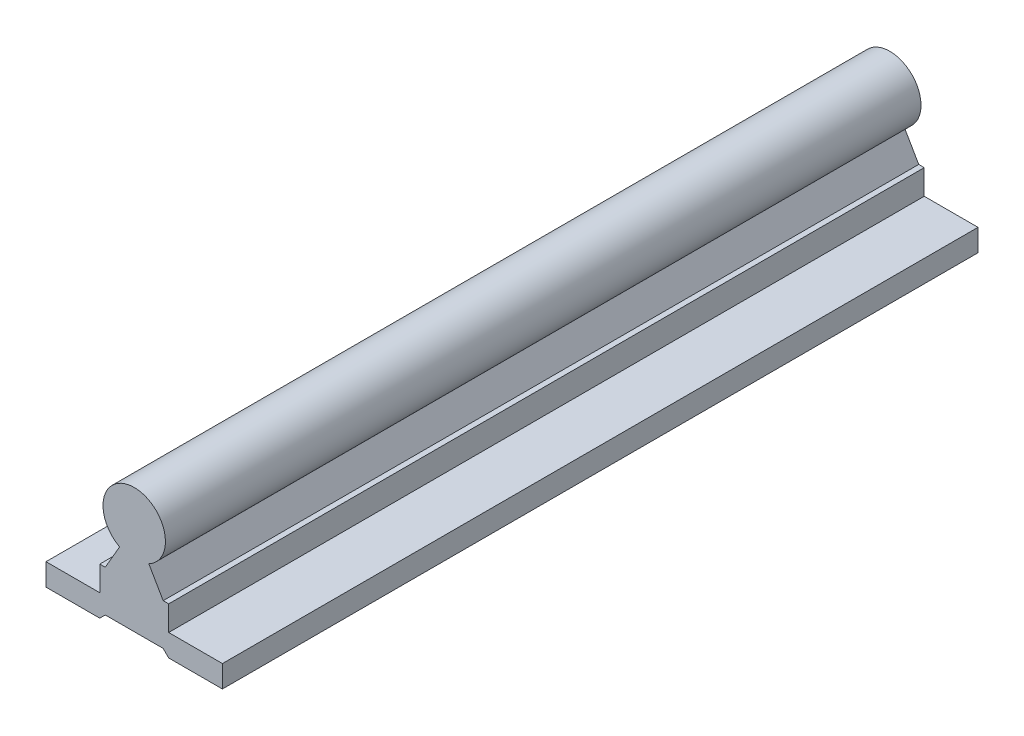
ISO-10303-21;
HEADER;
FILE_DESCRIPTION(('STEP AP214'),'2;1');
FILE_NAME('part.step','',(''),(''),'','','');
FILE_SCHEMA(('AUTOMOTIVE_DESIGN { 1 0 10303 214 1 1 1 1 }'));
ENDSEC;
DATA;
#1=APPLICATION_CONTEXT('core data for automotive mechanical design processes');
#2=APPLICATION_PROTOCOL_DEFINITION('international standard','automotive_design',2000,#1);
#3=PRODUCT_CONTEXT('',#1,'mechanical');
#4=PRODUCT('Part','Part','',(#3));
#5=PRODUCT_RELATED_PRODUCT_CATEGORY('part','',(#4));
#6=PRODUCT_DEFINITION_FORMATION('','',#4);
#7=PRODUCT_DEFINITION_CONTEXT('part definition',#1,'design');
#8=PRODUCT_DEFINITION('design','',#6,#7);
#9=PRODUCT_DEFINITION_SHAPE('','',#8);
#10=(LENGTH_UNIT() NAMED_UNIT(*) SI_UNIT(.MILLI.,.METRE.));
#11=(NAMED_UNIT(*) PLANE_ANGLE_UNIT() SI_UNIT($,.RADIAN.));
#12=(NAMED_UNIT(*) SI_UNIT($,.STERADIAN.) SOLID_ANGLE_UNIT());
#13=UNCERTAINTY_MEASURE_WITH_UNIT(LENGTH_MEASURE(1.E-05),#10,'distance_accuracy_value','');
#14=(GEOMETRIC_REPRESENTATION_CONTEXT(3) GLOBAL_UNCERTAINTY_ASSIGNED_CONTEXT((#13)) GLOBAL_UNIT_ASSIGNED_CONTEXT((#10,
#11,#12)) REPRESENTATION_CONTEXT('',''));
#15=CARTESIAN_POINT('',(0.,0.,0.));
#16=DIRECTION('',(0.,0.,1.));
#17=DIRECTION('',(1.,0.,0.));
#18=AXIS2_PLACEMENT_3D('',#15,#16,#17);
#19=CARTESIAN_POINT('',(-16.,0.,68.52));
#20=DIRECTION('',(0.,1.,0.));
#21=DIRECTION('',(0.,0.,1.));
#22=AXIS2_PLACEMENT_3D('',#19,#20,#21);
#23=PLANE('',#22);
#24=DIRECTION('',(1.,0.,0.));
#25=VECTOR('',#24,1.);
#26=CARTESIAN_POINT('',(-16.,0.,-68.52));
#27=LINE('',#26,#25);
#28=CARTESIAN_POINT('',(-16.,0.,-68.52));
#29=VERTEX_POINT('',#28);
#30=CARTESIAN_POINT('',(-6.24999999999998,0.,-68.52));
#31=VERTEX_POINT('',#30);
#32=EDGE_CURVE('E231',#29,#31,#27,.T.);
#33=ORIENTED_EDGE('',*,*,#32,.T.);
#34=DIRECTION('',(0.,0.,1.));
#35=VECTOR('',#34,1.);
#36=CARTESIAN_POINT('',(-6.24999999999997,0.,68.52));
#37=LINE('',#36,#35);
#38=CARTESIAN_POINT('',(-6.24999999999997,0.,68.52));
#39=VERTEX_POINT('',#38);
#40=EDGE_CURVE('E11',#31,#39,#37,.T.);
#41=ORIENTED_EDGE('',*,*,#40,.T.);
#42=DIRECTION('',(1.,0.,0.));
#43=VECTOR('',#42,1.);
#44=CARTESIAN_POINT('',(-16.,0.,68.52));
#45=LINE('',#44,#43);
#46=CARTESIAN_POINT('',(-16.,0.,68.52));
#47=VERTEX_POINT('',#46);
#48=EDGE_CURVE('E255',#47,#39,#45,.T.);
#49=ORIENTED_EDGE('',*,*,#48,.F.);
#50=DIRECTION('',(0.,0.,-1.));
#51=VECTOR('',#50,1.);
#52=CARTESIAN_POINT('',(-16.,0.,68.52));
#53=LINE('',#52,#51);
#54=EDGE_CURVE('E173',#47,#29,#53,.T.);
#55=ORIENTED_EDGE('',*,*,#54,.T.);
#56=EDGE_LOOP('',(#33,#41,#49,#55));
#57=FACE_BOUND('',#56,.T.);
#58=ADVANCED_FACE('F35',(#57),#23,.F.);
#59=CARTESIAN_POINT('',(-16.,0.,68.52));
#60=DIRECTION('',(1.,0.,0.));
#61=DIRECTION('',(0.,0.,-1.));
#62=AXIS2_PLACEMENT_3D('',#59,#60,#61);
#63=PLANE('',#62);
#64=DIRECTION('',(0.,-1.,0.));
#65=VECTOR('',#64,1.);
#66=CARTESIAN_POINT('',(-16.,0.,-68.52));
#67=LINE('',#66,#65);
#68=CARTESIAN_POINT('',(-16.,4.,-68.52));
#69=VERTEX_POINT('',#68);
#70=EDGE_CURVE('E159',#69,#29,#67,.T.);
#71=ORIENTED_EDGE('',*,*,#70,.T.);
#72=ORIENTED_EDGE('',*,*,#54,.F.);
#73=DIRECTION('',(0.,-1.,0.));
#74=VECTOR('',#73,1.);
#75=CARTESIAN_POINT('',(-16.,0.,68.52));
#76=LINE('',#75,#74);
#77=CARTESIAN_POINT('',(-16.,4.,68.52));
#78=VERTEX_POINT('',#77);
#79=EDGE_CURVE('E212',#78,#47,#76,.T.);
#80=ORIENTED_EDGE('',*,*,#79,.F.);
#81=DIRECTION('',(0.,0.,-1.));
#82=VECTOR('',#81,1.);
#83=CARTESIAN_POINT('',(-16.,4.,68.52));
#84=LINE('',#83,#82);
#85=EDGE_CURVE('E206',#78,#69,#84,.T.);
#86=ORIENTED_EDGE('',*,*,#85,.T.);
#87=EDGE_LOOP('',(#71,#72,#80,#86));
#88=FACE_BOUND('',#87,.T.);
#89=ADVANCED_FACE('F271',(#88),#63,.F.);
#90=CARTESIAN_POINT('',(6.24999999999997,0.,68.52));
#91=VERTEX_POINT('',#90);
#92=CARTESIAN_POINT('',(16.,0.,68.52));
#93=VERTEX_POINT('',#92);
#94=EDGE_CURVE('E258',#91,#93,#45,.T.);
#95=ORIENTED_EDGE('',*,*,#94,.F.);
#96=DIRECTION('',(0.,0.,-1.));
#97=VECTOR('',#96,1.);
#98=CARTESIAN_POINT('',(6.24999999999997,0.,68.52));
#99=LINE('',#98,#97);
#100=CARTESIAN_POINT('',(6.24999999999997,0.,-68.52));
#101=VERTEX_POINT('',#100);
#102=EDGE_CURVE('E58',#91,#101,#99,.T.);
#103=ORIENTED_EDGE('',*,*,#102,.T.);
#104=CARTESIAN_POINT('',(16.,0.,-68.52));
#105=VERTEX_POINT('',#104);
#106=EDGE_CURVE('E233',#101,#105,#27,.T.);
#107=ORIENTED_EDGE('',*,*,#106,.T.);
#108=DIRECTION('',(0.,0.,-1.));
#109=VECTOR('',#108,1.);
#110=CARTESIAN_POINT('',(16.,0.,68.52));
#111=LINE('',#110,#109);
#112=EDGE_CURVE('E176',#93,#105,#111,.T.);
#113=ORIENTED_EDGE('',*,*,#112,.F.);
#114=EDGE_LOOP('',(#95,#103,#107,#113));
#115=FACE_BOUND('',#114,.T.);
#116=ADVANCED_FACE('F322',(#115),#23,.F.);
#117=CARTESIAN_POINT('',(16.,0.,68.52));
#118=DIRECTION('',(-1.,0.,0.));
#119=DIRECTION('',(0.,0.,1.));
#120=AXIS2_PLACEMENT_3D('',#117,#118,#119);
#121=PLANE('',#120);
#122=DIRECTION('',(0.,1.,0.));
#123=VECTOR('',#122,1.);
#124=CARTESIAN_POINT('',(16.,0.,-68.52));
#125=LINE('',#124,#123);
#126=CARTESIAN_POINT('',(16.,4.,-68.52));
#127=VERTEX_POINT('',#126);
#128=EDGE_CURVE('E229',#105,#127,#125,.T.);
#129=ORIENTED_EDGE('',*,*,#128,.T.);
#130=DIRECTION('',(0.,0.,-1.));
#131=VECTOR('',#130,1.);
#132=CARTESIAN_POINT('',(16.,4.,68.52));
#133=LINE('',#132,#131);
#134=CARTESIAN_POINT('',(16.,4.,68.52));
#135=VERTEX_POINT('',#134);
#136=EDGE_CURVE('E179',#135,#127,#133,.T.);
#137=ORIENTED_EDGE('',*,*,#136,.F.);
#138=DIRECTION('',(0.,1.,0.));
#139=VECTOR('',#138,1.);
#140=CARTESIAN_POINT('',(16.,0.,68.52));
#141=LINE('',#140,#139);
#142=EDGE_CURVE('E253',#93,#135,#141,.T.);
#143=ORIENTED_EDGE('',*,*,#142,.F.);
#144=ORIENTED_EDGE('',*,*,#112,.T.);
#145=EDGE_LOOP('',(#129,#137,#143,#144));
#146=FACE_BOUND('',#145,.T.);
#147=ADVANCED_FACE('F320',(#146),#121,.F.);
#148=CARTESIAN_POINT('',(6.25,4.,68.52));
#149=DIRECTION('',(0.,-1.,0.));
#150=DIRECTION('',(0.,0.,-1.));
#151=AXIS2_PLACEMENT_3D('',#148,#149,#150);
#152=PLANE('',#151);
#153=DIRECTION('',(-1.,0.,0.));
#154=VECTOR('',#153,1.);
#155=CARTESIAN_POINT('',(6.25,4.,-68.52));
#156=LINE('',#155,#154);
#157=CARTESIAN_POINT('',(6.25,4.,-68.52));
#158=VERTEX_POINT('',#157);
#159=EDGE_CURVE('E227',#127,#158,#156,.T.);
#160=ORIENTED_EDGE('',*,*,#159,.T.);
#161=DIRECTION('',(0.,0.,-1.));
#162=VECTOR('',#161,1.);
#163=CARTESIAN_POINT('',(6.25,4.,68.52));
#164=LINE('',#163,#162);
#165=CARTESIAN_POINT('',(6.25,4.,68.52));
#166=VERTEX_POINT('',#165);
#167=EDGE_CURVE('E182',#166,#158,#164,.T.);
#168=ORIENTED_EDGE('',*,*,#167,.F.);
#169=DIRECTION('',(-1.,0.,0.));
#170=VECTOR('',#169,1.);
#171=CARTESIAN_POINT('',(6.25,4.,68.52));
#172=LINE('',#171,#170);
#173=EDGE_CURVE('E251',#135,#166,#172,.T.);
#174=ORIENTED_EDGE('',*,*,#173,.F.);
#175=ORIENTED_EDGE('',*,*,#136,.T.);
#176=EDGE_LOOP('',(#160,#168,#174,#175));
#177=FACE_BOUND('',#176,.T.);
#178=ADVANCED_FACE('F315',(#177),#152,.F.);
#179=CARTESIAN_POINT('',(6.25,4.,68.52));
#180=DIRECTION('',(-1.,0.,0.));
#181=DIRECTION('',(0.,-1.,0.));
#182=AXIS2_PLACEMENT_3D('',#179,#180,#181);
#183=PLANE('',#182);
#184=DIRECTION('',(0.,1.,0.));
#185=VECTOR('',#184,1.);
#186=CARTESIAN_POINT('',(6.25,4.,-68.52));
#187=LINE('',#186,#185);
#188=CARTESIAN_POINT('',(6.25,8.5,-68.52));
#189=VERTEX_POINT('',#188);
#190=EDGE_CURVE('E225',#158,#189,#187,.T.);
#191=ORIENTED_EDGE('',*,*,#190,.T.);
#192=DIRECTION('',(0.,0.,-1.));
#193=VECTOR('',#192,1.);
#194=CARTESIAN_POINT('',(6.25,8.5,68.52));
#195=LINE('',#194,#193);
#196=CARTESIAN_POINT('',(6.25,8.5,68.52));
#197=VERTEX_POINT('',#196);
#198=EDGE_CURVE('E185',#197,#189,#195,.T.);
#199=ORIENTED_EDGE('',*,*,#198,.F.);
#200=DIRECTION('',(0.,1.,0.));
#201=VECTOR('',#200,1.);
#202=CARTESIAN_POINT('',(6.25,4.,68.52));
#203=LINE('',#202,#201);
#204=EDGE_CURVE('E249',#166,#197,#203,.T.);
#205=ORIENTED_EDGE('',*,*,#204,.F.);
#206=ORIENTED_EDGE('',*,*,#167,.T.);
#207=EDGE_LOOP('',(#191,#199,#205,#206));
#208=FACE_BOUND('',#207,.T.);
#209=ADVANCED_FACE('F310',(#208),#183,.F.);
#210=CARTESIAN_POINT('',(6.25,8.5,68.52));
#211=DIRECTION('',(0.,-1.,0.));
#212=DIRECTION('',(0.,0.,-1.));
#213=AXIS2_PLACEMENT_3D('',#210,#211,#212);
#214=PLANE('',#213);
#215=DIRECTION('',(-1.,0.,0.));
#216=VECTOR('',#215,1.);
#217=CARTESIAN_POINT('',(6.25,8.5,-68.52));
#218=LINE('',#217,#216);
#219=CARTESIAN_POINT('',(5.25,8.5,-68.52));
#220=VERTEX_POINT('',#219);
#221=EDGE_CURVE('E223',#189,#220,#218,.T.);
#222=ORIENTED_EDGE('',*,*,#221,.T.);
#223=DIRECTION('',(0.,0.,-1.));
#224=VECTOR('',#223,1.);
#225=CARTESIAN_POINT('',(5.25,8.5,68.52));
#226=LINE('',#225,#224);
#227=CARTESIAN_POINT('',(5.25,8.5,68.52));
#228=VERTEX_POINT('',#227);
#229=EDGE_CURVE('E188',#228,#220,#226,.T.);
#230=ORIENTED_EDGE('',*,*,#229,.F.);
#231=DIRECTION('',(-1.,0.,0.));
#232=VECTOR('',#231,1.);
#233=CARTESIAN_POINT('',(6.25,8.5,68.52));
#234=LINE('',#233,#232);
#235=EDGE_CURVE('E247',#197,#228,#234,.T.);
#236=ORIENTED_EDGE('',*,*,#235,.F.);
#237=ORIENTED_EDGE('',*,*,#198,.T.);
#238=EDGE_LOOP('',(#222,#230,#236,#237));
#239=FACE_BOUND('',#238,.T.);
#240=ADVANCED_FACE('F306',(#239),#214,.F.);
#241=CARTESIAN_POINT('',(5.25,8.5,68.52));
#242=DIRECTION('',(-0.866025403784438,-0.500000000000001,0.));
#243=DIRECTION('',(0.500000000000001,-0.866025403784438,0.));
#244=AXIS2_PLACEMENT_3D('',#241,#242,#243);
#245=PLANE('',#244);
#246=DIRECTION('',(-0.500000000000001,0.866025403784438,0.));
#247=VECTOR('',#246,1.);
#248=CARTESIAN_POINT('',(5.25,8.5,-68.52));
#249=LINE('',#248,#247);
#250=CARTESIAN_POINT('',(2.65192378864667,13.,-68.52));
#251=VERTEX_POINT('',#250);
#252=EDGE_CURVE('E221',#220,#251,#249,.T.);
#253=ORIENTED_EDGE('',*,*,#252,.T.);
#254=DIRECTION('',(0.,0.,-1.));
#255=VECTOR('',#254,1.);
#256=CARTESIAN_POINT('',(2.65192378864667,13.,68.52));
#257=LINE('',#256,#255);
#258=CARTESIAN_POINT('',(2.65192378864667,13.,68.52));
#259=VERTEX_POINT('',#258);
#260=EDGE_CURVE('E191',#259,#251,#257,.T.);
#261=ORIENTED_EDGE('',*,*,#260,.F.);
#262=DIRECTION('',(-0.500000000000001,0.866025403784438,0.));
#263=VECTOR('',#262,1.);
#264=CARTESIAN_POINT('',(5.25,8.5,68.52));
#265=LINE('',#264,#263);
#266=EDGE_CURVE('E245',#228,#259,#265,.T.);
#267=ORIENTED_EDGE('',*,*,#266,.F.);
#268=ORIENTED_EDGE('',*,*,#229,.T.);
#269=EDGE_LOOP('',(#253,#261,#267,#268));
#270=FACE_BOUND('',#269,.T.);
#271=ADVANCED_FACE('F301',(#270),#245,.F.);
#272=CARTESIAN_POINT('',(0.,18.,68.52));
#273=DIRECTION('',(0.,0.,-1.));
#274=DIRECTION('',(-1.,0.,0.));
#275=AXIS2_PLACEMENT_3D('',#272,#273,#274);
#276=CYLINDRICAL_SURFACE('',#275,5.65974379109074);
#277=CARTESIAN_POINT('',(0.,18.,-68.52));
#278=DIRECTION('',(0.,0.,1.));
#279=DIRECTION('',(-1.,0.,0.));
#280=AXIS2_PLACEMENT_3D('',#277,#278,#279);
#281=CIRCLE('',#280,5.65974379109074);
#282=CARTESIAN_POINT('',(-2.6519237886467,13.,-68.52));
#283=VERTEX_POINT('',#282);
#284=EDGE_CURVE('E219',#251,#283,#281,.T.);
#285=ORIENTED_EDGE('',*,*,#284,.T.);
#286=DIRECTION('',(0.,0.,-1.));
#287=VECTOR('',#286,1.);
#288=CARTESIAN_POINT('',(-2.6519237886467,13.,68.52));
#289=LINE('',#288,#287);
#290=CARTESIAN_POINT('',(-2.6519237886467,13.,68.52));
#291=VERTEX_POINT('',#290);
#292=EDGE_CURVE('E194',#291,#283,#289,.T.);
#293=ORIENTED_EDGE('',*,*,#292,.F.);
#294=CARTESIAN_POINT('',(0.,18.,68.52));
#295=DIRECTION('',(0.,0.,1.));
#296=DIRECTION('',(-1.,0.,0.));
#297=AXIS2_PLACEMENT_3D('',#294,#295,#296);
#298=CIRCLE('',#297,5.65974379109074);
#299=EDGE_CURVE('E243',#259,#291,#298,.T.);
#300=ORIENTED_EDGE('',*,*,#299,.F.);
#301=ORIENTED_EDGE('',*,*,#260,.T.);
#302=EDGE_LOOP('',(#285,#293,#300,#301));
#303=FACE_BOUND('',#302,.T.);
#304=ADVANCED_FACE('F295',(#303),#276,.T.);
#305=CARTESIAN_POINT('',(-2.6519237886467,13.,68.52));
#306=DIRECTION('',(0.86602540378444,-0.499999999999997,0.));
#307=DIRECTION('',(0.499999999999998,0.86602540378444,0.));
#308=AXIS2_PLACEMENT_3D('',#305,#306,#307);
#309=PLANE('',#308);
#310=DIRECTION('',(-0.499999999999997,-0.86602540378444,0.));
#311=VECTOR('',#310,1.);
#312=CARTESIAN_POINT('',(-2.6519237886467,13.,-68.52));
#313=LINE('',#312,#311);
#314=CARTESIAN_POINT('',(-5.25,8.5,-68.52));
#315=VERTEX_POINT('',#314);
#316=EDGE_CURVE('E217',#283,#315,#313,.T.);
#317=ORIENTED_EDGE('',*,*,#316,.T.);
#318=DIRECTION('',(0.,0.,-1.));
#319=VECTOR('',#318,1.);
#320=CARTESIAN_POINT('',(-5.25,8.5,68.52));
#321=LINE('',#320,#319);
#322=CARTESIAN_POINT('',(-5.25,8.5,68.52));
#323=VERTEX_POINT('',#322);
#324=EDGE_CURVE('E197',#323,#315,#321,.T.);
#325=ORIENTED_EDGE('',*,*,#324,.F.);
#326=DIRECTION('',(-0.499999999999997,-0.86602540378444,0.));
#327=VECTOR('',#326,1.);
#328=CARTESIAN_POINT('',(-2.6519237886467,13.,68.52));
#329=LINE('',#328,#327);
#330=EDGE_CURVE('E241',#291,#323,#329,.T.);
#331=ORIENTED_EDGE('',*,*,#330,.F.);
#332=ORIENTED_EDGE('',*,*,#292,.T.);
#333=EDGE_LOOP('',(#317,#325,#331,#332));
#334=FACE_BOUND('',#333,.T.);
#335=ADVANCED_FACE('F291',(#334),#309,.F.);
#336=CARTESIAN_POINT('',(-6.25,8.5,68.52));
#337=DIRECTION('',(0.,-1.,0.));
#338=DIRECTION('',(0.,0.,-1.));
#339=AXIS2_PLACEMENT_3D('',#336,#337,#338);
#340=PLANE('',#339);
#341=DIRECTION('',(-1.,0.,0.));
#342=VECTOR('',#341,1.);
#343=CARTESIAN_POINT('',(-6.25,8.5,-68.52));
#344=LINE('',#343,#342);
#345=CARTESIAN_POINT('',(-6.25,8.5,-68.52));
#346=VERTEX_POINT('',#345);
#347=EDGE_CURVE('E215',#315,#346,#344,.T.);
#348=ORIENTED_EDGE('',*,*,#347,.T.);
#349=DIRECTION('',(0.,0.,-1.));
#350=VECTOR('',#349,1.);
#351=CARTESIAN_POINT('',(-6.25,8.5,68.52));
#352=LINE('',#351,#350);
#353=CARTESIAN_POINT('',(-6.25,8.5,68.52));
#354=VERTEX_POINT('',#353);
#355=EDGE_CURVE('E200',#354,#346,#352,.T.);
#356=ORIENTED_EDGE('',*,*,#355,.F.);
#357=DIRECTION('',(-1.,0.,0.));
#358=VECTOR('',#357,1.);
#359=CARTESIAN_POINT('',(-6.25,8.5,68.52));
#360=LINE('',#359,#358);
#361=EDGE_CURVE('E239',#323,#354,#360,.T.);
#362=ORIENTED_EDGE('',*,*,#361,.F.);
#363=ORIENTED_EDGE('',*,*,#324,.T.);
#364=EDGE_LOOP('',(#348,#356,#362,#363));
#365=FACE_BOUND('',#364,.T.);
#366=ADVANCED_FACE('F286',(#365),#340,.F.);
#367=CARTESIAN_POINT('',(-6.25,4.,68.52));
#368=DIRECTION('',(1.,0.,0.));
#369=DIRECTION('',(0.,0.,-1.));
#370=AXIS2_PLACEMENT_3D('',#367,#368,#369);
#371=PLANE('',#370);
#372=DIRECTION('',(0.,-1.,0.));
#373=VECTOR('',#372,1.);
#374=CARTESIAN_POINT('',(-6.25,4.,-68.52));
#375=LINE('',#374,#373);
#376=CARTESIAN_POINT('',(-6.25,4.,-68.52));
#377=VERTEX_POINT('',#376);
#378=EDGE_CURVE('E213',#346,#377,#375,.T.);
#379=ORIENTED_EDGE('',*,*,#378,.T.);
#380=DIRECTION('',(0.,0.,-1.));
#381=VECTOR('',#380,1.);
#382=CARTESIAN_POINT('',(-6.25,4.,68.52));
#383=LINE('',#382,#381);
#384=CARTESIAN_POINT('',(-6.25,4.,68.52));
#385=VERTEX_POINT('',#384);
#386=EDGE_CURVE('E203',#385,#377,#383,.T.);
#387=ORIENTED_EDGE('',*,*,#386,.F.);
#388=DIRECTION('',(0.,-1.,0.));
#389=VECTOR('',#388,1.);
#390=CARTESIAN_POINT('',(-6.25,4.,68.52));
#391=LINE('',#390,#389);
#392=EDGE_CURVE('E237',#354,#385,#391,.T.);
#393=ORIENTED_EDGE('',*,*,#392,.F.);
#394=ORIENTED_EDGE('',*,*,#355,.T.);
#395=EDGE_LOOP('',(#379,#387,#393,#394));
#396=FACE_BOUND('',#395,.T.);
#397=ADVANCED_FACE('F280',(#396),#371,.F.);
#398=CARTESIAN_POINT('',(-16.,4.,68.52));
#399=DIRECTION('',(0.,-1.,0.));
#400=DIRECTION('',(0.,0.,-1.));
#401=AXIS2_PLACEMENT_3D('',#398,#399,#400);
#402=PLANE('',#401);
#403=DIRECTION('',(-1.,0.,0.));
#404=VECTOR('',#403,1.);
#405=CARTESIAN_POINT('',(-16.,4.,-68.52));
#406=LINE('',#405,#404);
#407=EDGE_CURVE('E210',#377,#69,#406,.T.);
#408=ORIENTED_EDGE('',*,*,#407,.T.);
#409=ORIENTED_EDGE('',*,*,#85,.F.);
#410=DIRECTION('',(-1.,0.,0.));
#411=VECTOR('',#410,1.);
#412=CARTESIAN_POINT('',(-16.,4.,68.52));
#413=LINE('',#412,#411);
#414=EDGE_CURVE('E209',#385,#78,#413,.T.);
#415=ORIENTED_EDGE('',*,*,#414,.F.);
#416=ORIENTED_EDGE('',*,*,#386,.T.);
#417=EDGE_LOOP('',(#408,#409,#415,#416));
#418=FACE_BOUND('',#417,.T.);
#419=ADVANCED_FACE('F276',(#418),#402,.F.);
#420=CARTESIAN_POINT('',(0.,18.,68.52));
#421=DIRECTION('',(0.,0.,-1.));
#422=DIRECTION('',(-1.,0.,0.));
#423=AXIS2_PLACEMENT_3D('',#420,#421,#422);
#424=PLANE('',#423);
#425=DIRECTION('',(-1.,0.,0.));
#426=VECTOR('',#425,1.);
#427=CARTESIAN_POINT('',(-5.25,1.,68.52));
#428=LINE('',#427,#426);
#429=CARTESIAN_POINT('',(5.25,1.,68.52));
#430=VERTEX_POINT('',#429);
#431=CARTESIAN_POINT('',(-5.25,1.,68.52));
#432=VERTEX_POINT('',#431);
#433=EDGE_CURVE('E157',#430,#432,#428,.T.);
#434=ORIENTED_EDGE('',*,*,#433,.F.);
#435=DIRECTION('',(-0.707106781186547,0.707106781186548,0.));
#436=VECTOR('',#435,1.);
#437=CARTESIAN_POINT('',(5.25,0.999999999999973,68.52));
#438=LINE('',#437,#436);
#439=EDGE_CURVE('E167',#430,#91,#438,.F.);
#440=ORIENTED_EDGE('',*,*,#439,.T.);
#441=ORIENTED_EDGE('',*,*,#94,.T.);
#442=ORIENTED_EDGE('',*,*,#142,.T.);
#443=ORIENTED_EDGE('',*,*,#173,.T.);
#444=ORIENTED_EDGE('',*,*,#204,.T.);
#445=ORIENTED_EDGE('',*,*,#235,.T.);
#446=ORIENTED_EDGE('',*,*,#266,.T.);
#447=ORIENTED_EDGE('',*,*,#299,.T.);
#448=ORIENTED_EDGE('',*,*,#330,.T.);
#449=ORIENTED_EDGE('',*,*,#361,.T.);
#450=ORIENTED_EDGE('',*,*,#392,.T.);
#451=ORIENTED_EDGE('',*,*,#414,.T.);
#452=ORIENTED_EDGE('',*,*,#79,.T.);
#453=ORIENTED_EDGE('',*,*,#48,.T.);
#454=DIRECTION('',(-0.707106781186548,-0.707106781186547,0.));
#455=VECTOR('',#454,1.);
#456=CARTESIAN_POINT('',(-6.24999999999997,0.,68.52));
#457=LINE('',#456,#455);
#458=EDGE_CURVE('E171',#39,#432,#457,.F.);
#459=ORIENTED_EDGE('',*,*,#458,.T.);
#460=EDGE_LOOP('',(#434,#440,#441,#442,#443,#444,#445,#446,#447,#448,#449,#450,#451,#452,#453,#459));
#461=FACE_BOUND('',#460,.T.);
#462=ADVANCED_FACE('F264',(#461),#424,.F.);
#463=CARTESIAN_POINT('',(0.,18.,-68.52));
#464=DIRECTION('',(0.,0.,-1.));
#465=DIRECTION('',(-1.,0.,0.));
#466=AXIS2_PLACEMENT_3D('',#463,#464,#465);
#467=PLANE('',#466);
#468=ORIENTED_EDGE('',*,*,#106,.F.);
#469=DIRECTION('',(0.707106781186547,-0.707106781186548,0.));
#470=VECTOR('',#469,1.);
#471=CARTESIAN_POINT('',(-5.87500000000002,12.125,-68.52));
#472=LINE('',#471,#470);
#473=CARTESIAN_POINT('',(5.25,0.999999999999997,-68.52));
#474=VERTEX_POINT('',#473);
#475=EDGE_CURVE('E43',#101,#474,#472,.F.);
#476=ORIENTED_EDGE('',*,*,#475,.T.);
#477=DIRECTION('',(-1.,0.,0.));
#478=VECTOR('',#477,1.);
#479=CARTESIAN_POINT('',(-5.25,1.,-68.52));
#480=LINE('',#479,#478);
#481=CARTESIAN_POINT('',(-5.25,1.,-68.52));
#482=VERTEX_POINT('',#481);
#483=EDGE_CURVE('E154',#474,#482,#480,.T.);
#484=ORIENTED_EDGE('',*,*,#483,.T.);
#485=DIRECTION('',(0.707106781186548,0.707106781186547,0.));
#486=VECTOR('',#485,1.);
#487=CARTESIAN_POINT('',(5.875,12.125,-68.52));
#488=LINE('',#487,#486);
#489=EDGE_CURVE('E50',#482,#31,#488,.F.);
#490=ORIENTED_EDGE('',*,*,#489,.T.);
#491=ORIENTED_EDGE('',*,*,#32,.F.);
#492=ORIENTED_EDGE('',*,*,#70,.F.);
#493=ORIENTED_EDGE('',*,*,#407,.F.);
#494=ORIENTED_EDGE('',*,*,#378,.F.);
#495=ORIENTED_EDGE('',*,*,#347,.F.);
#496=ORIENTED_EDGE('',*,*,#316,.F.);
#497=ORIENTED_EDGE('',*,*,#284,.F.);
#498=ORIENTED_EDGE('',*,*,#252,.F.);
#499=ORIENTED_EDGE('',*,*,#221,.F.);
#500=ORIENTED_EDGE('',*,*,#190,.F.);
#501=ORIENTED_EDGE('',*,*,#159,.F.);
#502=ORIENTED_EDGE('',*,*,#128,.F.);
#503=EDGE_LOOP('',(#468,#476,#484,#490,#491,#492,#493,#494,#495,#496,#497,#498,#499,#500,#501,#502));
#504=FACE_BOUND('',#503,.T.);
#505=ADVANCED_FACE('F162',(#504),#467,.T.);
#506=CARTESIAN_POINT('',(-5.25,1.,-68.52));
#507=DIRECTION('',(0.,1.,0.));
#508=DIRECTION('',(0.,0.,1.));
#509=AXIS2_PLACEMENT_3D('',#506,#507,#508);
#510=PLANE('',#509);
#511=ORIENTED_EDGE('',*,*,#433,.T.);
#512=DIRECTION('',(0.,0.,1.));
#513=VECTOR('',#512,1.);
#514=CARTESIAN_POINT('',(-5.25,1.,-68.52));
#515=LINE('',#514,#513);
#516=EDGE_CURVE('E151',#482,#432,#515,.T.);
#517=ORIENTED_EDGE('',*,*,#516,.F.);
#518=ORIENTED_EDGE('',*,*,#483,.F.);
#519=DIRECTION('',(0.,0.,1.));
#520=VECTOR('',#519,1.);
#521=CARTESIAN_POINT('',(5.25,1.,-68.52));
#522=LINE('',#521,#520);
#523=EDGE_CURVE('E160',#474,#430,#522,.T.);
#524=ORIENTED_EDGE('',*,*,#523,.T.);
#525=EDGE_LOOP('',(#511,#517,#518,#524));
#526=FACE_BOUND('',#525,.T.);
#527=ADVANCED_FACE('F152',(#526),#510,.F.);
#528=CARTESIAN_POINT('',(5.25,0.999999999999973,-68.52));
#529=DIRECTION('',(0.707106781186548,0.707106781186547,0.));
#530=DIRECTION('',(0.,0.,1.));
#531=AXIS2_PLACEMENT_3D('',#528,#529,#530);
#532=PLANE('',#531);
#533=ORIENTED_EDGE('',*,*,#475,.F.);
#534=ORIENTED_EDGE('',*,*,#102,.F.);
#535=ORIENTED_EDGE('',*,*,#439,.F.);
#536=ORIENTED_EDGE('',*,*,#523,.F.);
#537=EDGE_LOOP('',(#533,#534,#535,#536));
#538=FACE_BOUND('',#537,.T.);
#539=ADVANCED_FACE('F323',(#538),#532,.F.);
#540=CARTESIAN_POINT('',(-6.24999999999997,0.,68.52));
#541=DIRECTION('',(-0.707106781186547,0.707106781186548,0.));
#542=DIRECTION('',(0.,0.,1.));
#543=AXIS2_PLACEMENT_3D('',#540,#541,#542);
#544=PLANE('',#543);
#545=ORIENTED_EDGE('',*,*,#489,.F.);
#546=ORIENTED_EDGE('',*,*,#516,.T.);
#547=ORIENTED_EDGE('',*,*,#458,.F.);
#548=ORIENTED_EDGE('',*,*,#40,.F.);
#549=EDGE_LOOP('',(#545,#546,#547,#548));
#550=FACE_BOUND('',#549,.T.);
#551=ADVANCED_FACE('F37',(#550),#544,.F.);
#552=CLOSED_SHELL('',(#58,#89,#116,#147,#178,#209,#240,#271,#304,#335,#366,#397,#419,#462,#505,
#527,#539,#551));
#553=MANIFOLD_SOLID_BREP('B2',#552);
#554=ADVANCED_BREP_SHAPE_REPRESENTATION('',(#18,#553),#14);
#555=SHAPE_DEFINITION_REPRESENTATION(#9,#554);
ENDSEC;
END-ISO-10303-21;
